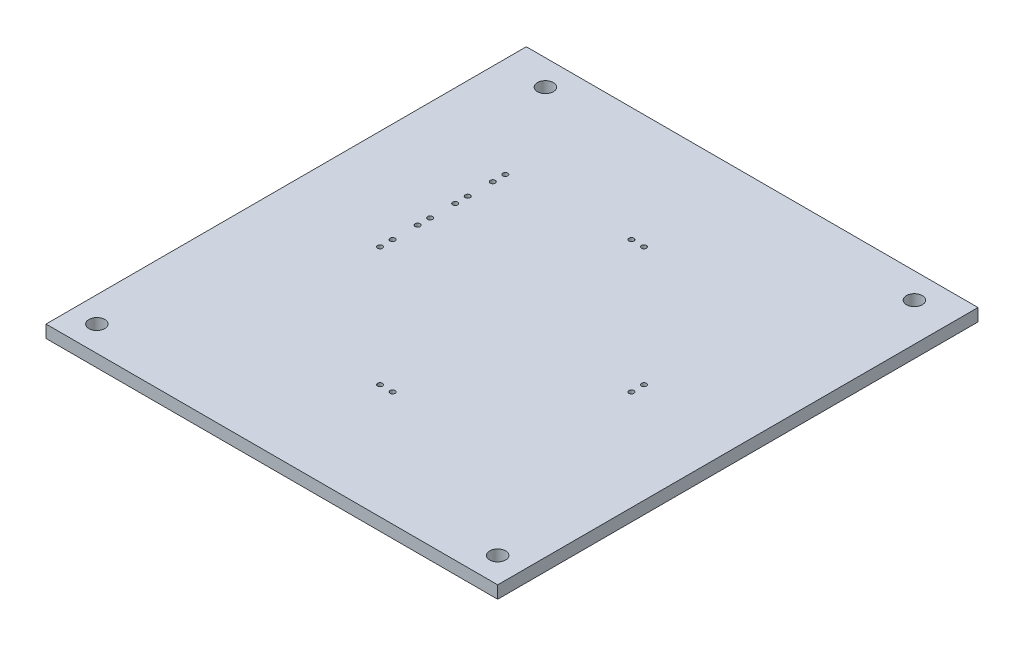
ISO-10303-21;
HEADER;
FILE_DESCRIPTION(('STEP AP214'),'2;1');
FILE_NAME('part.step','',(''),(''),'','','');
FILE_SCHEMA(('AUTOMOTIVE_DESIGN { 1 0 10303 214 1 1 1 1 }'));
ENDSEC;
DATA;
#1=APPLICATION_CONTEXT('core data for automotive mechanical design processes');
#2=APPLICATION_PROTOCOL_DEFINITION('international standard','automotive_design',2000,#1);
#3=PRODUCT_CONTEXT('',#1,'mechanical');
#4=PRODUCT('Part','Part','',(#3));
#5=PRODUCT_RELATED_PRODUCT_CATEGORY('part','',(#4));
#6=PRODUCT_DEFINITION_FORMATION('','',#4);
#7=PRODUCT_DEFINITION_CONTEXT('part definition',#1,'design');
#8=PRODUCT_DEFINITION('design','',#6,#7);
#9=PRODUCT_DEFINITION_SHAPE('','',#8);
#10=(LENGTH_UNIT() NAMED_UNIT(*) SI_UNIT(.MILLI.,.METRE.));
#11=(NAMED_UNIT(*) PLANE_ANGLE_UNIT() SI_UNIT($,.RADIAN.));
#12=(NAMED_UNIT(*) SI_UNIT($,.STERADIAN.) SOLID_ANGLE_UNIT());
#13=UNCERTAINTY_MEASURE_WITH_UNIT(LENGTH_MEASURE(1.E-05),#10,'distance_accuracy_value','');
#14=(GEOMETRIC_REPRESENTATION_CONTEXT(3) GLOBAL_UNCERTAINTY_ASSIGNED_CONTEXT((#13)) GLOBAL_UNIT_ASSIGNED_CONTEXT((#10,
#11,#12)) REPRESENTATION_CONTEXT('',''));
#15=CARTESIAN_POINT('',(0.,0.,0.));
#16=DIRECTION('',(0.,0.,1.));
#17=DIRECTION('',(1.,0.,0.));
#18=AXIS2_PLACEMENT_3D('',#15,#16,#17);
#19=CARTESIAN_POINT('',(45.085,2.5,47.9425));
#20=DIRECTION('',(-1.,0.,0.));
#21=DIRECTION('',(0.,0.,1.));
#22=AXIS2_PLACEMENT_3D('',#19,#20,#21);
#23=PLANE('',#22);
#24=DIRECTION('',(0.,0.,-1.));
#25=VECTOR('',#24,1.);
#26=CARTESIAN_POINT('',(45.085,0.,47.9425));
#27=LINE('',#26,#25);
#28=CARTESIAN_POINT('',(45.085,0.,47.9425));
#29=VERTEX_POINT('',#28);
#30=CARTESIAN_POINT('',(45.085,0.,-47.9425));
#31=VERTEX_POINT('',#30);
#32=EDGE_CURVE('E104',#29,#31,#27,.T.);
#33=ORIENTED_EDGE('',*,*,#32,.T.);
#34=DIRECTION('',(0.,-1.,0.));
#35=VECTOR('',#34,1.);
#36=CARTESIAN_POINT('',(45.085,2.5,-47.9425));
#37=LINE('',#36,#35);
#38=CARTESIAN_POINT('',(45.085,2.5,-47.9425));
#39=VERTEX_POINT('',#38);
#40=EDGE_CURVE('E95',#39,#31,#37,.T.);
#41=ORIENTED_EDGE('',*,*,#40,.F.);
#42=DIRECTION('',(0.,0.,-1.));
#43=VECTOR('',#42,1.);
#44=CARTESIAN_POINT('',(45.085,2.5,47.9425));
#45=LINE('',#44,#43);
#46=CARTESIAN_POINT('',(45.085,2.5,47.9425));
#47=VERTEX_POINT('',#46);
#48=EDGE_CURVE('E89',#47,#39,#45,.T.);
#49=ORIENTED_EDGE('',*,*,#48,.F.);
#50=DIRECTION('',(0.,-1.,0.));
#51=VECTOR('',#50,1.);
#52=CARTESIAN_POINT('',(45.085,2.5,47.9425));
#53=LINE('',#52,#51);
#54=EDGE_CURVE('E100',#47,#29,#53,.T.);
#55=ORIENTED_EDGE('',*,*,#54,.T.);
#56=EDGE_LOOP('',(#33,#41,#49,#55));
#57=FACE_BOUND('',#56,.T.);
#58=ADVANCED_FACE('F35',(#57),#23,.F.);
#59=CARTESIAN_POINT('',(-45.085,2.5,-47.9425));
#60=DIRECTION('',(0.,0.,1.));
#61=DIRECTION('',(1.,0.,0.));
#62=AXIS2_PLACEMENT_3D('',#59,#60,#61);
#63=PLANE('',#62);
#64=DIRECTION('',(-1.,0.,0.));
#65=VECTOR('',#64,1.);
#66=CARTESIAN_POINT('',(-45.085,0.,-47.9425));
#67=LINE('',#66,#65);
#68=CARTESIAN_POINT('',(-45.085,0.,-47.9425));
#69=VERTEX_POINT('',#68);
#70=EDGE_CURVE('E94',#31,#69,#67,.T.);
#71=ORIENTED_EDGE('',*,*,#70,.T.);
#72=DIRECTION('',(0.,-1.,0.));
#73=VECTOR('',#72,1.);
#74=CARTESIAN_POINT('',(-45.085,2.5,-47.9425));
#75=LINE('',#74,#73);
#76=CARTESIAN_POINT('',(-45.085,2.5,-47.9425));
#77=VERTEX_POINT('',#76);
#78=EDGE_CURVE('E92',#77,#69,#75,.T.);
#79=ORIENTED_EDGE('',*,*,#78,.F.);
#80=DIRECTION('',(-1.,0.,0.));
#81=VECTOR('',#80,1.);
#82=CARTESIAN_POINT('',(-45.085,2.5,-47.9425));
#83=LINE('',#82,#81);
#84=EDGE_CURVE('E83',#39,#77,#83,.T.);
#85=ORIENTED_EDGE('',*,*,#84,.F.);
#86=ORIENTED_EDGE('',*,*,#40,.T.);
#87=EDGE_LOOP('',(#71,#79,#85,#86));
#88=FACE_BOUND('',#87,.T.);
#89=ADVANCED_FACE('F93',(#88),#63,.F.);
#90=CARTESIAN_POINT('',(-45.085,2.5,47.9425));
#91=DIRECTION('',(1.,0.,0.));
#92=DIRECTION('',(0.,0.,-1.));
#93=AXIS2_PLACEMENT_3D('',#90,#91,#92);
#94=PLANE('',#93);
#95=DIRECTION('',(0.,0.,1.));
#96=VECTOR('',#95,1.);
#97=CARTESIAN_POINT('',(-45.085,0.,47.9425));
#98=LINE('',#97,#96);
#99=CARTESIAN_POINT('',(-45.085,0.,47.9425));
#100=VERTEX_POINT('',#99);
#101=EDGE_CURVE('E69',#69,#100,#98,.T.);
#102=ORIENTED_EDGE('',*,*,#101,.T.);
#103=DIRECTION('',(0.,-1.,0.));
#104=VECTOR('',#103,1.);
#105=CARTESIAN_POINT('',(-45.085,2.5,47.9425));
#106=LINE('',#105,#104);
#107=CARTESIAN_POINT('',(-45.085,2.5,47.9425));
#108=VERTEX_POINT('',#107);
#109=EDGE_CURVE('E96',#108,#100,#106,.T.);
#110=ORIENTED_EDGE('',*,*,#109,.F.);
#111=DIRECTION('',(0.,0.,1.));
#112=VECTOR('',#111,1.);
#113=CARTESIAN_POINT('',(-45.085,2.5,47.9425));
#114=LINE('',#113,#112);
#115=EDGE_CURVE('E87',#77,#108,#114,.T.);
#116=ORIENTED_EDGE('',*,*,#115,.F.);
#117=ORIENTED_EDGE('',*,*,#78,.T.);
#118=EDGE_LOOP('',(#102,#110,#116,#117));
#119=FACE_BOUND('',#118,.T.);
#120=ADVANCED_FACE('F98',(#119),#94,.F.);
#121=CARTESIAN_POINT('',(-45.085,2.5,47.9425));
#122=DIRECTION('',(0.,0.,-1.));
#123=DIRECTION('',(-1.,0.,0.));
#124=AXIS2_PLACEMENT_3D('',#121,#122,#123);
#125=PLANE('',#124);
#126=DIRECTION('',(1.,0.,0.));
#127=VECTOR('',#126,1.);
#128=CARTESIAN_POINT('',(-45.085,0.,47.9425));
#129=LINE('',#128,#127);
#130=EDGE_CURVE('E75',#100,#29,#129,.T.);
#131=ORIENTED_EDGE('',*,*,#130,.T.);
#132=ORIENTED_EDGE('',*,*,#54,.F.);
#133=DIRECTION('',(1.,0.,0.));
#134=VECTOR('',#133,1.);
#135=CARTESIAN_POINT('',(-45.085,2.5,47.9425));
#136=LINE('',#135,#134);
#137=EDGE_CURVE('E52',#108,#47,#136,.T.);
#138=ORIENTED_EDGE('',*,*,#137,.F.);
#139=ORIENTED_EDGE('',*,*,#109,.T.);
#140=EDGE_LOOP('',(#131,#132,#138,#139));
#141=FACE_BOUND('',#140,.T.);
#142=ADVANCED_FACE('F182',(#141),#125,.F.);
#143=CARTESIAN_POINT('',(0.,2.5,0.));
#144=DIRECTION('',(0.,-1.,0.));
#145=DIRECTION('',(0.,0.,-1.));
#146=AXIS2_PLACEMENT_3D('',#143,#144,#145);
#147=PLANE('',#146);
#148=CARTESIAN_POINT('',(-25.085,2.5,-8.75));
#149=DIRECTION('',(0.,1.,0.));
#150=DIRECTION('',(0.,0.,1.));
#151=AXIS2_PLACEMENT_3D('',#148,#149,#150);
#152=CIRCLE('',#151,0.499999999999999);
#153=CARTESIAN_POINT('',(-25.085,2.5,-8.25));
#154=VERTEX_POINT('',#153);
#155=EDGE_CURVE('E486',#154,#154,#152,.T.);
#156=ORIENTED_EDGE('',*,*,#155,.F.);
#157=EDGE_LOOP('',(#156));
#158=FACE_BOUND('',#157,.T.);
#159=CARTESIAN_POINT('',(-25.085,2.5,-6.25));
#160=DIRECTION('',(0.,1.,0.));
#161=DIRECTION('',(0.,0.,1.));
#162=AXIS2_PLACEMENT_3D('',#159,#160,#161);
#163=CIRCLE('',#162,0.499999999999999);
#164=CARTESIAN_POINT('',(-25.085,2.5,-5.75));
#165=VERTEX_POINT('',#164);
#166=EDGE_CURVE('E480',#165,#165,#163,.T.);
#167=ORIENTED_EDGE('',*,*,#166,.F.);
#168=EDGE_LOOP('',(#167));
#169=FACE_BOUND('',#168,.T.);
#170=CARTESIAN_POINT('',(1.24999999999974,2.5,25.085));
#171=DIRECTION('',(0.,1.,0.));
#172=DIRECTION('',(1.,0.,0.));
#173=AXIS2_PLACEMENT_3D('',#170,#171,#172);
#174=CIRCLE('',#173,0.499999999999999);
#175=CARTESIAN_POINT('',(1.74999999999974,2.5,25.085));
#176=VERTEX_POINT('',#175);
#177=EDGE_CURVE('E147',#176,#176,#174,.T.);
#178=ORIENTED_EDGE('',*,*,#177,.F.);
#179=EDGE_LOOP('',(#178));
#180=FACE_BOUND('',#179,.T.);
#181=CARTESIAN_POINT('',(-1.25000000000026,2.5,25.085));
#182=DIRECTION('',(0.,1.,0.));
#183=DIRECTION('',(1.,0.,0.));
#184=AXIS2_PLACEMENT_3D('',#181,#182,#183);
#185=CIRCLE('',#184,0.499999999999999);
#186=CARTESIAN_POINT('',(-0.750000000000264,2.5,25.085));
#187=VERTEX_POINT('',#186);
#188=EDGE_CURVE('E143',#187,#187,#185,.T.);
#189=ORIENTED_EDGE('',*,*,#188,.F.);
#190=EDGE_LOOP('',(#189));
#191=FACE_BOUND('',#190,.T.);
#192=CARTESIAN_POINT('',(25.085,2.5,-1.25));
#193=DIRECTION('',(0.,1.,0.));
#194=DIRECTION('',(0.,0.,-1.));
#195=AXIS2_PLACEMENT_3D('',#192,#193,#194);
#196=CIRCLE('',#195,0.499999999999999);
#197=CARTESIAN_POINT('',(25.085,2.5,-1.75));
#198=VERTEX_POINT('',#197);
#199=EDGE_CURVE('E139',#198,#198,#196,.T.);
#200=ORIENTED_EDGE('',*,*,#199,.F.);
#201=EDGE_LOOP('',(#200));
#202=FACE_BOUND('',#201,.T.);
#203=CARTESIAN_POINT('',(25.085,2.5,1.25));
#204=DIRECTION('',(0.,1.,0.));
#205=DIRECTION('',(0.,0.,-1.));
#206=AXIS2_PLACEMENT_3D('',#203,#204,#205);
#207=CIRCLE('',#206,0.499999999999999);
#208=CARTESIAN_POINT('',(25.085,2.5,0.750000000000001));
#209=VERTEX_POINT('',#208);
#210=EDGE_CURVE('E135',#209,#209,#207,.T.);
#211=ORIENTED_EDGE('',*,*,#210,.F.);
#212=EDGE_LOOP('',(#211));
#213=FACE_BOUND('',#212,.T.);
#214=CARTESIAN_POINT('',(-1.24999999999991,2.5,-25.085));
#215=DIRECTION('',(0.,1.,0.));
#216=DIRECTION('',(-1.,0.,0.));
#217=AXIS2_PLACEMENT_3D('',#214,#215,#216);
#218=CIRCLE('',#217,0.499999999999999);
#219=CARTESIAN_POINT('',(-1.74999999999991,2.5,-25.085));
#220=VERTEX_POINT('',#219);
#221=EDGE_CURVE('E131',#220,#220,#218,.T.);
#222=ORIENTED_EDGE('',*,*,#221,.F.);
#223=EDGE_LOOP('',(#222));
#224=FACE_BOUND('',#223,.T.);
#225=CARTESIAN_POINT('',(1.25000000000009,2.5,-25.085));
#226=DIRECTION('',(0.,1.,0.));
#227=DIRECTION('',(-1.,0.,0.));
#228=AXIS2_PLACEMENT_3D('',#225,#226,#227);
#229=CIRCLE('',#228,0.499999999999999);
#230=CARTESIAN_POINT('',(0.750000000000089,2.5,-25.085));
#231=VERTEX_POINT('',#230);
#232=EDGE_CURVE('E127',#231,#231,#229,.T.);
#233=ORIENTED_EDGE('',*,*,#232,.F.);
#234=EDGE_LOOP('',(#233));
#235=FACE_BOUND('',#234,.T.);
#236=CARTESIAN_POINT('',(-25.085,2.5,1.25));
#237=DIRECTION('',(0.,1.,0.));
#238=DIRECTION('',(0.,0.,1.));
#239=AXIS2_PLACEMENT_3D('',#236,#237,#238);
#240=CIRCLE('',#239,0.499999999999999);
#241=CARTESIAN_POINT('',(-25.085,2.5,1.75));
#242=VERTEX_POINT('',#241);
#243=EDGE_CURVE('E123',#242,#242,#240,.T.);
#244=ORIENTED_EDGE('',*,*,#243,.F.);
#245=EDGE_LOOP('',(#244));
#246=FACE_BOUND('',#245,.T.);
#247=CARTESIAN_POINT('',(-25.085,2.5,-1.25));
#248=DIRECTION('',(0.,1.,0.));
#249=DIRECTION('',(0.,0.,1.));
#250=AXIS2_PLACEMENT_3D('',#247,#248,#249);
#251=CIRCLE('',#250,0.499999999999999);
#252=CARTESIAN_POINT('',(-25.085,2.5,-0.750000000000001));
#253=VERTEX_POINT('',#252);
#254=EDGE_CURVE('E119',#253,#253,#251,.T.);
#255=ORIENTED_EDGE('',*,*,#254,.F.);
#256=EDGE_LOOP('',(#255));
#257=FACE_BOUND('',#256,.T.);
#258=CARTESIAN_POINT('',(40.005,2.5,42.8625));
#259=DIRECTION('',(0.,1.,0.));
#260=DIRECTION('',(0.,0.,1.));
#261=AXIS2_PLACEMENT_3D('',#258,#259,#260);
#262=CIRCLE('',#261,1.5875);
#263=CARTESIAN_POINT('',(40.005,2.5,44.45));
#264=VERTEX_POINT('',#263);
#265=EDGE_CURVE('E118',#264,#264,#262,.T.);
#266=ORIENTED_EDGE('',*,*,#265,.F.);
#267=EDGE_LOOP('',(#266));
#268=FACE_BOUND('',#267,.T.);
#269=CARTESIAN_POINT('',(37.465,2.5,-42.8625));
#270=DIRECTION('',(0.,1.,0.));
#271=DIRECTION('',(0.,0.,1.));
#272=AXIS2_PLACEMENT_3D('',#269,#270,#271);
#273=CIRCLE('',#272,1.5875);
#274=CARTESIAN_POINT('',(37.465,2.5,-41.275));
#275=VERTEX_POINT('',#274);
#276=EDGE_CURVE('E287',#275,#275,#273,.T.);
#277=ORIENTED_EDGE('',*,*,#276,.F.);
#278=EDGE_LOOP('',(#277));
#279=FACE_BOUND('',#278,.T.);
#280=CARTESIAN_POINT('',(-36.195,2.5,-42.8625));
#281=DIRECTION('',(0.,1.,0.));
#282=DIRECTION('',(0.,0.,1.));
#283=AXIS2_PLACEMENT_3D('',#280,#281,#282);
#284=CIRCLE('',#283,1.5875);
#285=CARTESIAN_POINT('',(-36.195,2.5,-41.275));
#286=VERTEX_POINT('',#285);
#287=EDGE_CURVE('E280',#286,#286,#284,.T.);
#288=ORIENTED_EDGE('',*,*,#287,.F.);
#289=EDGE_LOOP('',(#288));
#290=FACE_BOUND('',#289,.T.);
#291=CARTESIAN_POINT('',(-40.005,2.5,42.8625));
#292=DIRECTION('',(0.,1.,0.));
#293=DIRECTION('',(0.,0.,1.));
#294=AXIS2_PLACEMENT_3D('',#291,#292,#293);
#295=CIRCLE('',#294,1.5875);
#296=CARTESIAN_POINT('',(-40.005,2.5,44.45));
#297=VERTEX_POINT('',#296);
#298=EDGE_CURVE('E284',#297,#297,#295,.T.);
#299=ORIENTED_EDGE('',*,*,#298,.F.);
#300=EDGE_LOOP('',(#299));
#301=FACE_BOUND('',#300,.T.);
#302=ORIENTED_EDGE('',*,*,#48,.T.);
#303=ORIENTED_EDGE('',*,*,#84,.T.);
#304=ORIENTED_EDGE('',*,*,#115,.T.);
#305=ORIENTED_EDGE('',*,*,#137,.T.);
#306=EDGE_LOOP('',(#302,#303,#304,#305));
#307=FACE_BOUND('',#306,.T.);
#308=CARTESIAN_POINT('',(-25.085,2.5,-13.75));
#309=DIRECTION('',(0.,1.,0.));
#310=DIRECTION('',(0.,0.,1.));
#311=AXIS2_PLACEMENT_3D('',#308,#309,#310);
#312=CIRCLE('',#311,0.499999999999999);
#313=CARTESIAN_POINT('',(-25.085,2.5,-13.25));
#314=VERTEX_POINT('',#313);
#315=EDGE_CURVE('E150',#314,#314,#312,.T.);
#316=ORIENTED_EDGE('',*,*,#315,.F.);
#317=EDGE_LOOP('',(#316));
#318=FACE_BOUND('',#317,.T.);
#319=CARTESIAN_POINT('',(-25.085,2.5,-21.25));
#320=DIRECTION('',(0.,1.,0.));
#321=DIRECTION('',(0.,0.,1.));
#322=AXIS2_PLACEMENT_3D('',#319,#320,#321);
#323=CIRCLE('',#322,0.499999999999999);
#324=CARTESIAN_POINT('',(-25.085,2.5,-20.75));
#325=VERTEX_POINT('',#324);
#326=EDGE_CURVE('E156',#325,#325,#323,.T.);
#327=ORIENTED_EDGE('',*,*,#326,.F.);
#328=EDGE_LOOP('',(#327));
#329=FACE_BOUND('',#328,.T.);
#330=CARTESIAN_POINT('',(-25.085,2.5,-16.25));
#331=DIRECTION('',(0.,1.,0.));
#332=DIRECTION('',(0.,0.,1.));
#333=AXIS2_PLACEMENT_3D('',#330,#331,#332);
#334=CIRCLE('',#333,0.499999999999999);
#335=CARTESIAN_POINT('',(-25.085,2.5,-15.75));
#336=VERTEX_POINT('',#335);
#337=EDGE_CURVE('E162',#336,#336,#334,.T.);
#338=ORIENTED_EDGE('',*,*,#337,.F.);
#339=EDGE_LOOP('',(#338));
#340=FACE_BOUND('',#339,.T.);
#341=CARTESIAN_POINT('',(-25.085,2.5,-23.75));
#342=DIRECTION('',(0.,1.,0.));
#343=DIRECTION('',(0.,0.,1.));
#344=AXIS2_PLACEMENT_3D('',#341,#342,#343);
#345=CIRCLE('',#344,0.499999999999999);
#346=CARTESIAN_POINT('',(-25.085,2.5,-23.25));
#347=VERTEX_POINT('',#346);
#348=EDGE_CURVE('E11',#347,#347,#345,.T.);
#349=ORIENTED_EDGE('',*,*,#348,.F.);
#350=EDGE_LOOP('',(#349));
#351=FACE_BOUND('',#350,.T.);
#352=ADVANCED_FACE('F84',(#158,#169,#180,#191,#202,#213,#224,#235,#246,#257,#268,#279,#290,#301,
#307,#318,#329,#340,#351),#147,.F.);
#353=CARTESIAN_POINT('',(0.,0.,0.));
#354=DIRECTION('',(0.,-1.,0.));
#355=DIRECTION('',(0.,0.,-1.));
#356=AXIS2_PLACEMENT_3D('',#353,#354,#355);
#357=PLANE('',#356);
#358=CARTESIAN_POINT('',(-25.085,0.,-8.75));
#359=DIRECTION('',(0.,-1.,0.));
#360=DIRECTION('',(0.,0.,-1.));
#361=AXIS2_PLACEMENT_3D('',#358,#359,#360);
#362=CIRCLE('',#361,0.499999999999999);
#363=CARTESIAN_POINT('',(-25.085,0.,-9.25));
#364=VERTEX_POINT('',#363);
#365=EDGE_CURVE('E489',#364,#364,#362,.T.);
#366=ORIENTED_EDGE('',*,*,#365,.F.);
#367=EDGE_LOOP('',(#366));
#368=FACE_BOUND('',#367,.T.);
#369=CARTESIAN_POINT('',(-25.085,0.,-6.25));
#370=DIRECTION('',(0.,-1.,0.));
#371=DIRECTION('',(0.,0.,-1.));
#372=AXIS2_PLACEMENT_3D('',#369,#370,#371);
#373=CIRCLE('',#372,0.499999999999999);
#374=CARTESIAN_POINT('',(-25.085,0.,-6.75));
#375=VERTEX_POINT('',#374);
#376=EDGE_CURVE('E483',#375,#375,#373,.T.);
#377=ORIENTED_EDGE('',*,*,#376,.F.);
#378=EDGE_LOOP('',(#377));
#379=FACE_BOUND('',#378,.T.);
#380=CARTESIAN_POINT('',(1.24999999999974,0.,25.085));
#381=DIRECTION('',(0.,-1.,0.));
#382=DIRECTION('',(0.,0.,-1.));
#383=AXIS2_PLACEMENT_3D('',#380,#381,#382);
#384=CIRCLE('',#383,0.499999999999999);
#385=CARTESIAN_POINT('',(1.24999999999974,0.,24.585));
#386=VERTEX_POINT('',#385);
#387=EDGE_CURVE('E144',#386,#386,#384,.T.);
#388=ORIENTED_EDGE('',*,*,#387,.F.);
#389=EDGE_LOOP('',(#388));
#390=FACE_BOUND('',#389,.T.);
#391=CARTESIAN_POINT('',(-1.25000000000026,0.,25.085));
#392=DIRECTION('',(0.,-1.,0.));
#393=DIRECTION('',(0.,0.,-1.));
#394=AXIS2_PLACEMENT_3D('',#391,#392,#393);
#395=CIRCLE('',#394,0.499999999999999);
#396=CARTESIAN_POINT('',(-1.25000000000026,0.,24.585));
#397=VERTEX_POINT('',#396);
#398=EDGE_CURVE('E140',#397,#397,#395,.T.);
#399=ORIENTED_EDGE('',*,*,#398,.F.);
#400=EDGE_LOOP('',(#399));
#401=FACE_BOUND('',#400,.T.);
#402=CARTESIAN_POINT('',(25.085,0.,-1.25));
#403=DIRECTION('',(0.,-1.,0.));
#404=DIRECTION('',(0.,0.,-1.));
#405=AXIS2_PLACEMENT_3D('',#402,#403,#404);
#406=CIRCLE('',#405,0.499999999999999);
#407=CARTESIAN_POINT('',(25.085,0.,-1.75));
#408=VERTEX_POINT('',#407);
#409=EDGE_CURVE('E136',#408,#408,#406,.T.);
#410=ORIENTED_EDGE('',*,*,#409,.F.);
#411=EDGE_LOOP('',(#410));
#412=FACE_BOUND('',#411,.T.);
#413=CARTESIAN_POINT('',(25.085,0.,1.25));
#414=DIRECTION('',(0.,-1.,0.));
#415=DIRECTION('',(0.,0.,-1.));
#416=AXIS2_PLACEMENT_3D('',#413,#414,#415);
#417=CIRCLE('',#416,0.499999999999999);
#418=CARTESIAN_POINT('',(25.085,0.,0.750000000000001));
#419=VERTEX_POINT('',#418);
#420=EDGE_CURVE('E132',#419,#419,#417,.T.);
#421=ORIENTED_EDGE('',*,*,#420,.F.);
#422=EDGE_LOOP('',(#421));
#423=FACE_BOUND('',#422,.T.);
#424=CARTESIAN_POINT('',(-1.24999999999991,0.,-25.085));
#425=DIRECTION('',(0.,-1.,0.));
#426=DIRECTION('',(0.,0.,-1.));
#427=AXIS2_PLACEMENT_3D('',#424,#425,#426);
#428=CIRCLE('',#427,0.499999999999999);
#429=CARTESIAN_POINT('',(-1.24999999999991,0.,-25.585));
#430=VERTEX_POINT('',#429);
#431=EDGE_CURVE('E128',#430,#430,#428,.T.);
#432=ORIENTED_EDGE('',*,*,#431,.F.);
#433=EDGE_LOOP('',(#432));
#434=FACE_BOUND('',#433,.T.);
#435=CARTESIAN_POINT('',(1.25000000000009,0.,-25.085));
#436=DIRECTION('',(0.,-1.,0.));
#437=DIRECTION('',(0.,0.,-1.));
#438=AXIS2_PLACEMENT_3D('',#435,#436,#437);
#439=CIRCLE('',#438,0.499999999999999);
#440=CARTESIAN_POINT('',(1.25000000000009,0.,-25.585));
#441=VERTEX_POINT('',#440);
#442=EDGE_CURVE('E124',#441,#441,#439,.T.);
#443=ORIENTED_EDGE('',*,*,#442,.F.);
#444=EDGE_LOOP('',(#443));
#445=FACE_BOUND('',#444,.T.);
#446=CARTESIAN_POINT('',(-25.085,0.,1.25));
#447=DIRECTION('',(0.,-1.,0.));
#448=DIRECTION('',(0.,0.,-1.));
#449=AXIS2_PLACEMENT_3D('',#446,#447,#448);
#450=CIRCLE('',#449,0.499999999999999);
#451=CARTESIAN_POINT('',(-25.085,0.,0.750000000000001));
#452=VERTEX_POINT('',#451);
#453=EDGE_CURVE('E120',#452,#452,#450,.T.);
#454=ORIENTED_EDGE('',*,*,#453,.F.);
#455=EDGE_LOOP('',(#454));
#456=FACE_BOUND('',#455,.T.);
#457=CARTESIAN_POINT('',(-25.085,0.,-1.25));
#458=DIRECTION('',(0.,-1.,0.));
#459=DIRECTION('',(0.,0.,-1.));
#460=AXIS2_PLACEMENT_3D('',#457,#458,#459);
#461=CIRCLE('',#460,0.499999999999999);
#462=CARTESIAN_POINT('',(-25.085,0.,-1.75));
#463=VERTEX_POINT('',#462);
#464=EDGE_CURVE('E115',#463,#463,#461,.T.);
#465=ORIENTED_EDGE('',*,*,#464,.F.);
#466=EDGE_LOOP('',(#465));
#467=FACE_BOUND('',#466,.T.);
#468=CARTESIAN_POINT('',(40.005,0.,42.8625));
#469=DIRECTION('',(0.,1.,0.));
#470=DIRECTION('',(0.,0.,1.));
#471=AXIS2_PLACEMENT_3D('',#468,#469,#470);
#472=CIRCLE('',#471,1.5875);
#473=CARTESIAN_POINT('',(40.005,0.,44.45));
#474=VERTEX_POINT('',#473);
#475=EDGE_CURVE('E458',#474,#474,#472,.T.);
#476=ORIENTED_EDGE('',*,*,#475,.T.);
#477=EDGE_LOOP('',(#476));
#478=FACE_BOUND('',#477,.T.);
#479=CARTESIAN_POINT('',(37.465,0.,-42.8625));
#480=DIRECTION('',(0.,1.,0.));
#481=DIRECTION('',(0.,0.,1.));
#482=AXIS2_PLACEMENT_3D('',#479,#480,#481);
#483=CIRCLE('',#482,1.5875);
#484=CARTESIAN_POINT('',(37.465,0.,-41.275));
#485=VERTEX_POINT('',#484);
#486=EDGE_CURVE('E282',#485,#485,#483,.T.);
#487=ORIENTED_EDGE('',*,*,#486,.T.);
#488=EDGE_LOOP('',(#487));
#489=FACE_BOUND('',#488,.T.);
#490=CARTESIAN_POINT('',(-36.195,0.,-42.8625));
#491=DIRECTION('',(0.,1.,0.));
#492=DIRECTION('',(0.,0.,1.));
#493=AXIS2_PLACEMENT_3D('',#490,#491,#492);
#494=CIRCLE('',#493,1.5875);
#495=CARTESIAN_POINT('',(-36.195,0.,-41.275));
#496=VERTEX_POINT('',#495);
#497=EDGE_CURVE('E277',#496,#496,#494,.T.);
#498=ORIENTED_EDGE('',*,*,#497,.T.);
#499=EDGE_LOOP('',(#498));
#500=FACE_BOUND('',#499,.T.);
#501=CARTESIAN_POINT('',(-40.005,0.,42.8625));
#502=DIRECTION('',(0.,1.,0.));
#503=DIRECTION('',(0.,0.,1.));
#504=AXIS2_PLACEMENT_3D('',#501,#502,#503);
#505=CIRCLE('',#504,1.5875);
#506=CARTESIAN_POINT('',(-40.005,0.,44.45));
#507=VERTEX_POINT('',#506);
#508=EDGE_CURVE('E107',#507,#507,#505,.T.);
#509=ORIENTED_EDGE('',*,*,#508,.T.);
#510=EDGE_LOOP('',(#509));
#511=FACE_BOUND('',#510,.T.);
#512=ORIENTED_EDGE('',*,*,#32,.F.);
#513=ORIENTED_EDGE('',*,*,#130,.F.);
#514=ORIENTED_EDGE('',*,*,#101,.F.);
#515=ORIENTED_EDGE('',*,*,#70,.F.);
#516=EDGE_LOOP('',(#512,#513,#514,#515));
#517=FACE_BOUND('',#516,.T.);
#518=CARTESIAN_POINT('',(-25.085,0.,-13.75));
#519=DIRECTION('',(0.,-1.,0.));
#520=DIRECTION('',(0.,0.,-1.));
#521=AXIS2_PLACEMENT_3D('',#518,#519,#520);
#522=CIRCLE('',#521,0.499999999999999);
#523=CARTESIAN_POINT('',(-25.085,0.,-14.25));
#524=VERTEX_POINT('',#523);
#525=EDGE_CURVE('E114',#524,#524,#522,.T.);
#526=ORIENTED_EDGE('',*,*,#525,.F.);
#527=EDGE_LOOP('',(#526));
#528=FACE_BOUND('',#527,.T.);
#529=CARTESIAN_POINT('',(-25.085,0.,-21.25));
#530=DIRECTION('',(0.,-1.,0.));
#531=DIRECTION('',(0.,0.,-1.));
#532=AXIS2_PLACEMENT_3D('',#529,#530,#531);
#533=CIRCLE('',#532,0.499999999999999);
#534=CARTESIAN_POINT('',(-25.085,0.,-21.75));
#535=VERTEX_POINT('',#534);
#536=EDGE_CURVE('E153',#535,#535,#533,.T.);
#537=ORIENTED_EDGE('',*,*,#536,.F.);
#538=EDGE_LOOP('',(#537));
#539=FACE_BOUND('',#538,.T.);
#540=CARTESIAN_POINT('',(-25.085,0.,-16.25));
#541=DIRECTION('',(0.,-1.,0.));
#542=DIRECTION('',(0.,0.,-1.));
#543=AXIS2_PLACEMENT_3D('',#540,#541,#542);
#544=CIRCLE('',#543,0.499999999999999);
#545=CARTESIAN_POINT('',(-25.085,0.,-16.75));
#546=VERTEX_POINT('',#545);
#547=EDGE_CURVE('E159',#546,#546,#544,.T.);
#548=ORIENTED_EDGE('',*,*,#547,.F.);
#549=EDGE_LOOP('',(#548));
#550=FACE_BOUND('',#549,.T.);
#551=CARTESIAN_POINT('',(-25.085,0.,-23.75));
#552=DIRECTION('',(0.,-1.,0.));
#553=DIRECTION('',(0.,0.,-1.));
#554=AXIS2_PLACEMENT_3D('',#551,#552,#553);
#555=CIRCLE('',#554,0.499999999999999);
#556=CARTESIAN_POINT('',(-25.085,0.,-24.25));
#557=VERTEX_POINT('',#556);
#558=EDGE_CURVE('E44',#557,#557,#555,.T.);
#559=ORIENTED_EDGE('',*,*,#558,.F.);
#560=EDGE_LOOP('',(#559));
#561=FACE_BOUND('',#560,.T.);
#562=ADVANCED_FACE('F169',(#368,#379,#390,#401,#412,#423,#434,#445,#456,#467,#478,#489,#500,
#511,#517,#528,#539,#550,#561),#357,.T.);
#563=CARTESIAN_POINT('',(-40.005,0.,42.8625));
#564=DIRECTION('',(0.,1.,0.));
#565=DIRECTION('',(0.,0.,1.));
#566=AXIS2_PLACEMENT_3D('',#563,#564,#565);
#567=CYLINDRICAL_SURFACE('',#566,1.5875);
#568=ORIENTED_EDGE('',*,*,#508,.F.);
#569=EDGE_LOOP('',(#568));
#570=FACE_BOUND('',#569,.T.);
#571=ORIENTED_EDGE('',*,*,#298,.T.);
#572=EDGE_LOOP('',(#571));
#573=FACE_BOUND('',#572,.T.);
#574=ADVANCED_FACE('F171',(#570,#573),#567,.F.);
#575=CARTESIAN_POINT('',(-36.195,0.,-42.8625));
#576=DIRECTION('',(0.,1.,0.));
#577=DIRECTION('',(0.,0.,1.));
#578=AXIS2_PLACEMENT_3D('',#575,#576,#577);
#579=CYLINDRICAL_SURFACE('',#578,1.5875);
#580=ORIENTED_EDGE('',*,*,#497,.F.);
#581=EDGE_LOOP('',(#580));
#582=FACE_BOUND('',#581,.T.);
#583=ORIENTED_EDGE('',*,*,#287,.T.);
#584=EDGE_LOOP('',(#583));
#585=FACE_BOUND('',#584,.T.);
#586=ADVANCED_FACE('F179',(#582,#585),#579,.F.);
#587=CARTESIAN_POINT('',(37.465,0.,-42.8625));
#588=DIRECTION('',(0.,1.,0.));
#589=DIRECTION('',(0.,0.,1.));
#590=AXIS2_PLACEMENT_3D('',#587,#588,#589);
#591=CYLINDRICAL_SURFACE('',#590,1.5875);
#592=ORIENTED_EDGE('',*,*,#486,.F.);
#593=EDGE_LOOP('',(#592));
#594=FACE_BOUND('',#593,.T.);
#595=ORIENTED_EDGE('',*,*,#276,.T.);
#596=EDGE_LOOP('',(#595));
#597=FACE_BOUND('',#596,.T.);
#598=ADVANCED_FACE('F265',(#594,#597),#591,.F.);
#599=CARTESIAN_POINT('',(40.005,0.,42.8625));
#600=DIRECTION('',(0.,1.,0.));
#601=DIRECTION('',(0.,0.,1.));
#602=AXIS2_PLACEMENT_3D('',#599,#600,#601);
#603=CYLINDRICAL_SURFACE('',#602,1.5875);
#604=ORIENTED_EDGE('',*,*,#475,.F.);
#605=EDGE_LOOP('',(#604));
#606=FACE_BOUND('',#605,.T.);
#607=ORIENTED_EDGE('',*,*,#265,.T.);
#608=EDGE_LOOP('',(#607));
#609=FACE_BOUND('',#608,.T.);
#610=ADVANCED_FACE('F261',(#606,#609),#603,.F.);
#611=CARTESIAN_POINT('',(-25.085,-7.5,-1.25));
#612=DIRECTION('',(0.,1.,0.));
#613=DIRECTION('',(0.,0.,1.));
#614=AXIS2_PLACEMENT_3D('',#611,#612,#613);
#615=CYLINDRICAL_SURFACE('',#614,0.499999999999999);
#616=ORIENTED_EDGE('',*,*,#464,.T.);
#617=EDGE_LOOP('',(#616));
#618=FACE_BOUND('',#617,.T.);
#619=ORIENTED_EDGE('',*,*,#254,.T.);
#620=EDGE_LOOP('',(#619));
#621=FACE_BOUND('',#620,.T.);
#622=ADVANCED_FACE('F257',(#618,#621),#615,.F.);
#623=CARTESIAN_POINT('',(-25.085,-7.5,1.25));
#624=DIRECTION('',(0.,1.,0.));
#625=DIRECTION('',(0.,0.,1.));
#626=AXIS2_PLACEMENT_3D('',#623,#624,#625);
#627=CYLINDRICAL_SURFACE('',#626,0.499999999999999);
#628=ORIENTED_EDGE('',*,*,#453,.T.);
#629=EDGE_LOOP('',(#628));
#630=FACE_BOUND('',#629,.T.);
#631=ORIENTED_EDGE('',*,*,#243,.T.);
#632=EDGE_LOOP('',(#631));
#633=FACE_BOUND('',#632,.T.);
#634=ADVANCED_FACE('F253',(#630,#633),#627,.F.);
#635=CARTESIAN_POINT('',(1.25000000000009,-7.5,-25.085));
#636=DIRECTION('',(0.,1.,0.));
#637=DIRECTION('',(0.,0.,1.));
#638=AXIS2_PLACEMENT_3D('',#635,#636,#637);
#639=CYLINDRICAL_SURFACE('',#638,0.499999999999999);
#640=ORIENTED_EDGE('',*,*,#442,.T.);
#641=EDGE_LOOP('',(#640));
#642=FACE_BOUND('',#641,.T.);
#643=ORIENTED_EDGE('',*,*,#232,.T.);
#644=EDGE_LOOP('',(#643));
#645=FACE_BOUND('',#644,.T.);
#646=ADVANCED_FACE('F249',(#642,#645),#639,.F.);
#647=CARTESIAN_POINT('',(-1.24999999999991,-7.5,-25.085));
#648=DIRECTION('',(0.,1.,0.));
#649=DIRECTION('',(0.,0.,1.));
#650=AXIS2_PLACEMENT_3D('',#647,#648,#649);
#651=CYLINDRICAL_SURFACE('',#650,0.499999999999999);
#652=ORIENTED_EDGE('',*,*,#431,.T.);
#653=EDGE_LOOP('',(#652));
#654=FACE_BOUND('',#653,.T.);
#655=ORIENTED_EDGE('',*,*,#221,.T.);
#656=EDGE_LOOP('',(#655));
#657=FACE_BOUND('',#656,.T.);
#658=ADVANCED_FACE('F245',(#654,#657),#651,.F.);
#659=CARTESIAN_POINT('',(25.085,-7.5,1.25));
#660=DIRECTION('',(0.,1.,0.));
#661=DIRECTION('',(0.,0.,1.));
#662=AXIS2_PLACEMENT_3D('',#659,#660,#661);
#663=CYLINDRICAL_SURFACE('',#662,0.499999999999999);
#664=ORIENTED_EDGE('',*,*,#420,.T.);
#665=EDGE_LOOP('',(#664));
#666=FACE_BOUND('',#665,.T.);
#667=ORIENTED_EDGE('',*,*,#210,.T.);
#668=EDGE_LOOP('',(#667));
#669=FACE_BOUND('',#668,.T.);
#670=ADVANCED_FACE('F241',(#666,#669),#663,.F.);
#671=CARTESIAN_POINT('',(25.085,-7.5,-1.25));
#672=DIRECTION('',(0.,1.,0.));
#673=DIRECTION('',(0.,0.,1.));
#674=AXIS2_PLACEMENT_3D('',#671,#672,#673);
#675=CYLINDRICAL_SURFACE('',#674,0.499999999999999);
#676=ORIENTED_EDGE('',*,*,#409,.T.);
#677=EDGE_LOOP('',(#676));
#678=FACE_BOUND('',#677,.T.);
#679=ORIENTED_EDGE('',*,*,#199,.T.);
#680=EDGE_LOOP('',(#679));
#681=FACE_BOUND('',#680,.T.);
#682=ADVANCED_FACE('F237',(#678,#681),#675,.F.);
#683=CARTESIAN_POINT('',(-1.25000000000026,-7.5,25.085));
#684=DIRECTION('',(0.,1.,0.));
#685=DIRECTION('',(0.,0.,1.));
#686=AXIS2_PLACEMENT_3D('',#683,#684,#685);
#687=CYLINDRICAL_SURFACE('',#686,0.499999999999999);
#688=ORIENTED_EDGE('',*,*,#398,.T.);
#689=EDGE_LOOP('',(#688));
#690=FACE_BOUND('',#689,.T.);
#691=ORIENTED_EDGE('',*,*,#188,.T.);
#692=EDGE_LOOP('',(#691));
#693=FACE_BOUND('',#692,.T.);
#694=ADVANCED_FACE('F233',(#690,#693),#687,.F.);
#695=CARTESIAN_POINT('',(1.24999999999974,-7.5,25.085));
#696=DIRECTION('',(0.,1.,0.));
#697=DIRECTION('',(0.,0.,1.));
#698=AXIS2_PLACEMENT_3D('',#695,#696,#697);
#699=CYLINDRICAL_SURFACE('',#698,0.499999999999999);
#700=ORIENTED_EDGE('',*,*,#387,.T.);
#701=EDGE_LOOP('',(#700));
#702=FACE_BOUND('',#701,.T.);
#703=ORIENTED_EDGE('',*,*,#177,.T.);
#704=EDGE_LOOP('',(#703));
#705=FACE_BOUND('',#704,.T.);
#706=ADVANCED_FACE('F229',(#702,#705),#699,.F.);
#707=CARTESIAN_POINT('',(-25.085,-7.5,-6.25));
#708=DIRECTION('',(0.,1.,0.));
#709=DIRECTION('',(0.,0.,1.));
#710=AXIS2_PLACEMENT_3D('',#707,#708,#709);
#711=CYLINDRICAL_SURFACE('',#710,0.499999999999999);
#712=ORIENTED_EDGE('',*,*,#376,.T.);
#713=EDGE_LOOP('',(#712));
#714=FACE_BOUND('',#713,.T.);
#715=ORIENTED_EDGE('',*,*,#166,.T.);
#716=EDGE_LOOP('',(#715));
#717=FACE_BOUND('',#716,.T.);
#718=ADVANCED_FACE('F201',(#714,#717),#711,.F.);
#719=CARTESIAN_POINT('',(-25.085,-7.5,-13.75));
#720=DIRECTION('',(0.,1.,0.));
#721=DIRECTION('',(0.,0.,1.));
#722=AXIS2_PLACEMENT_3D('',#719,#720,#721);
#723=CYLINDRICAL_SURFACE('',#722,0.499999999999999);
#724=ORIENTED_EDGE('',*,*,#525,.T.);
#725=EDGE_LOOP('',(#724));
#726=FACE_BOUND('',#725,.T.);
#727=ORIENTED_EDGE('',*,*,#315,.T.);
#728=EDGE_LOOP('',(#727));
#729=FACE_BOUND('',#728,.T.);
#730=ADVANCED_FACE('F197',(#726,#729),#723,.F.);
#731=CARTESIAN_POINT('',(-25.085,-7.5,-21.25));
#732=DIRECTION('',(0.,1.,0.));
#733=DIRECTION('',(0.,0.,1.));
#734=AXIS2_PLACEMENT_3D('',#731,#732,#733);
#735=CYLINDRICAL_SURFACE('',#734,0.499999999999999);
#736=ORIENTED_EDGE('',*,*,#536,.T.);
#737=EDGE_LOOP('',(#736));
#738=FACE_BOUND('',#737,.T.);
#739=ORIENTED_EDGE('',*,*,#326,.T.);
#740=EDGE_LOOP('',(#739));
#741=FACE_BOUND('',#740,.T.);
#742=ADVANCED_FACE('F200',(#738,#741),#735,.F.);
#743=CARTESIAN_POINT('',(-25.085,-7.5,-8.75));
#744=DIRECTION('',(0.,1.,0.));
#745=DIRECTION('',(0.,0.,1.));
#746=AXIS2_PLACEMENT_3D('',#743,#744,#745);
#747=CYLINDRICAL_SURFACE('',#746,0.499999999999999);
#748=ORIENTED_EDGE('',*,*,#365,.T.);
#749=EDGE_LOOP('',(#748));
#750=FACE_BOUND('',#749,.T.);
#751=ORIENTED_EDGE('',*,*,#155,.T.);
#752=EDGE_LOOP('',(#751));
#753=FACE_BOUND('',#752,.T.);
#754=ADVANCED_FACE('F204',(#750,#753),#747,.F.);
#755=CARTESIAN_POINT('',(-25.085,-7.5,-16.25));
#756=DIRECTION('',(0.,1.,0.));
#757=DIRECTION('',(0.,0.,1.));
#758=AXIS2_PLACEMENT_3D('',#755,#756,#757);
#759=CYLINDRICAL_SURFACE('',#758,0.499999999999999);
#760=ORIENTED_EDGE('',*,*,#547,.T.);
#761=EDGE_LOOP('',(#760));
#762=FACE_BOUND('',#761,.T.);
#763=ORIENTED_EDGE('',*,*,#337,.T.);
#764=EDGE_LOOP('',(#763));
#765=FACE_BOUND('',#764,.T.);
#766=ADVANCED_FACE('F206',(#762,#765),#759,.F.);
#767=CARTESIAN_POINT('',(-25.085,-7.5,-23.75));
#768=DIRECTION('',(0.,1.,0.));
#769=DIRECTION('',(0.,0.,1.));
#770=AXIS2_PLACEMENT_3D('',#767,#768,#769);
#771=CYLINDRICAL_SURFACE('',#770,0.499999999999999);
#772=ORIENTED_EDGE('',*,*,#558,.T.);
#773=EDGE_LOOP('',(#772));
#774=FACE_BOUND('',#773,.T.);
#775=ORIENTED_EDGE('',*,*,#348,.T.);
#776=EDGE_LOOP('',(#775));
#777=FACE_BOUND('',#776,.T.);
#778=ADVANCED_FACE('F37',(#774,#777),#771,.F.);
#779=CLOSED_SHELL('',(#58,#89,#120,#142,#352,#562,#574,#586,#598,#610,#622,#634,#646,#658,#670,
#682,#694,#706,#718,#730,#742,#754,#766,#778));
#780=MANIFOLD_SOLID_BREP('B2',#779);
#781=ADVANCED_BREP_SHAPE_REPRESENTATION('',(#18,#780),#14);
#782=SHAPE_DEFINITION_REPRESENTATION(#9,#781);
ENDSEC;
END-ISO-10303-21;
